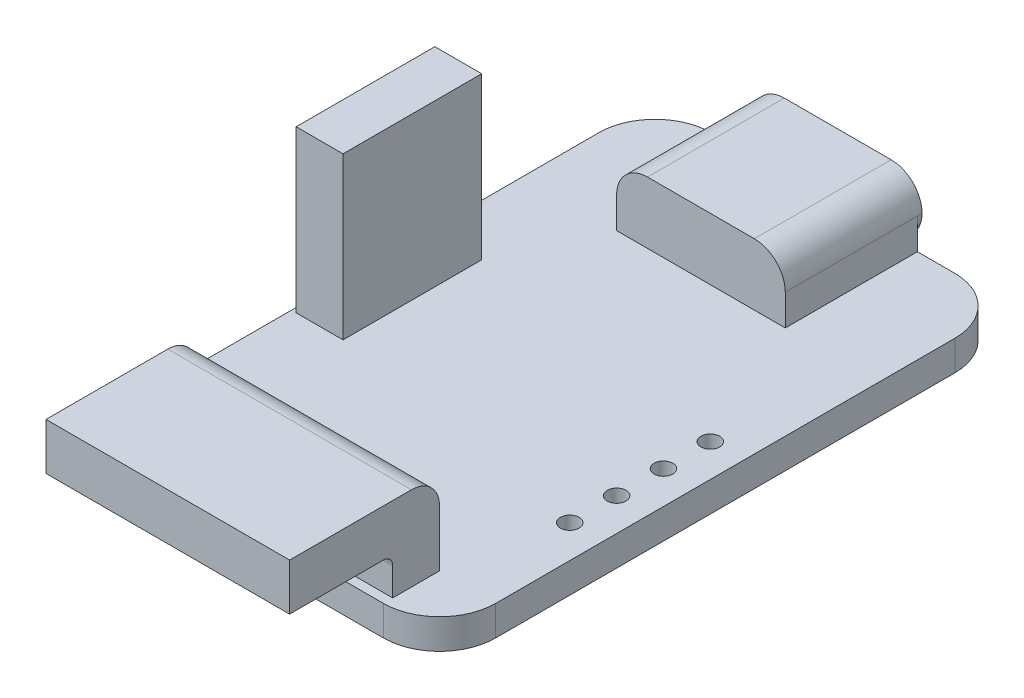
ISO-10303-21;
HEADER;
FILE_DESCRIPTION(('STEP AP214'),'2;1');
FILE_NAME('part.step','',(''),(''),'','','');
FILE_SCHEMA(('AUTOMOTIVE_DESIGN { 1 0 10303 214 1 1 1 1 }'));
ENDSEC;
DATA;
#1=APPLICATION_CONTEXT('core data for automotive mechanical design processes');
#2=APPLICATION_PROTOCOL_DEFINITION('international standard','automotive_design',2000,#1);
#3=PRODUCT_CONTEXT('',#1,'mechanical');
#4=PRODUCT('Part','Part','',(#3));
#5=PRODUCT_RELATED_PRODUCT_CATEGORY('part','',(#4));
#6=PRODUCT_DEFINITION_FORMATION('','',#4);
#7=PRODUCT_DEFINITION_CONTEXT('part definition',#1,'design');
#8=PRODUCT_DEFINITION('design','',#6,#7);
#9=PRODUCT_DEFINITION_SHAPE('','',#8);
#10=(LENGTH_UNIT() NAMED_UNIT(*) SI_UNIT(.MILLI.,.METRE.));
#11=(NAMED_UNIT(*) PLANE_ANGLE_UNIT() SI_UNIT($,.RADIAN.));
#12=(NAMED_UNIT(*) SI_UNIT($,.STERADIAN.) SOLID_ANGLE_UNIT());
#13=UNCERTAINTY_MEASURE_WITH_UNIT(LENGTH_MEASURE(1.E-05),#10,'distance_accuracy_value','');
#14=(GEOMETRIC_REPRESENTATION_CONTEXT(3) GLOBAL_UNCERTAINTY_ASSIGNED_CONTEXT((#13)) GLOBAL_UNIT_ASSIGNED_CONTEXT((#10,
#11,#12)) REPRESENTATION_CONTEXT('',''));
#15=CARTESIAN_POINT('',(0.,0.,0.));
#16=DIRECTION('',(0.,0.,1.));
#17=DIRECTION('',(1.,0.,0.));
#18=AXIS2_PLACEMENT_3D('',#15,#16,#17);
#19=CARTESIAN_POINT('',(7.75000000000001,1.6,6.55));
#20=DIRECTION('',(0.,-1.,0.));
#21=DIRECTION('',(0.,0.,-1.));
#22=AXIS2_PLACEMENT_3D('',#19,#20,#21);
#23=CYLINDRICAL_SURFACE('',#22,0.500000000000001);
#24=CARTESIAN_POINT('',(7.75000000000001,1.6,6.55));
#25=DIRECTION('',(0.,1.,0.));
#26=DIRECTION('',(0.,0.,1.));
#27=AXIS2_PLACEMENT_3D('',#24,#25,#26);
#28=CIRCLE('',#27,0.500000000000001);
#29=CARTESIAN_POINT('',(7.75000000000001,1.6,7.05));
#30=VERTEX_POINT('',#29);
#31=EDGE_CURVE('E56',#30,#30,#28,.T.);
#32=ORIENTED_EDGE('',*,*,#31,.T.);
#33=EDGE_LOOP('',(#32));
#34=FACE_BOUND('',#33,.T.);
#35=CARTESIAN_POINT('',(7.75000000000001,0.,6.55));
#36=DIRECTION('',(0.,1.,0.));
#37=DIRECTION('',(0.,0.,1.));
#38=AXIS2_PLACEMENT_3D('',#35,#36,#37);
#39=CIRCLE('',#38,0.500000000000001);
#40=CARTESIAN_POINT('',(7.75000000000001,0.,7.05));
#41=VERTEX_POINT('',#40);
#42=EDGE_CURVE('E12',#41,#41,#39,.T.);
#43=ORIENTED_EDGE('',*,*,#42,.F.);
#44=EDGE_LOOP('',(#43));
#45=FACE_BOUND('',#44,.T.);
#46=ADVANCED_FACE('F49',(#34,#45),#23,.F.);
#47=CARTESIAN_POINT('',(7.75000000000001,1.6,4.05));
#48=DIRECTION('',(0.,-1.,0.));
#49=DIRECTION('',(0.,0.,-1.));
#50=AXIS2_PLACEMENT_3D('',#47,#48,#49);
#51=CYLINDRICAL_SURFACE('',#50,0.500000000000001);
#52=CARTESIAN_POINT('',(7.75000000000001,1.6,4.05));
#53=DIRECTION('',(0.,1.,0.));
#54=DIRECTION('',(0.,0.,1.));
#55=AXIS2_PLACEMENT_3D('',#52,#53,#54);
#56=CIRCLE('',#55,0.500000000000001);
#57=CARTESIAN_POINT('',(7.75000000000001,1.6,4.55));
#58=VERTEX_POINT('',#57);
#59=EDGE_CURVE('E476',#58,#58,#56,.T.);
#60=ORIENTED_EDGE('',*,*,#59,.T.);
#61=EDGE_LOOP('',(#60));
#62=FACE_BOUND('',#61,.T.);
#63=CARTESIAN_POINT('',(7.75000000000001,0.,4.05));
#64=DIRECTION('',(0.,1.,0.));
#65=DIRECTION('',(0.,0.,1.));
#66=AXIS2_PLACEMENT_3D('',#63,#64,#65);
#67=CIRCLE('',#66,0.500000000000001);
#68=CARTESIAN_POINT('',(7.75000000000001,0.,4.55));
#69=VERTEX_POINT('',#68);
#70=EDGE_CURVE('E479',#69,#69,#67,.T.);
#71=ORIENTED_EDGE('',*,*,#70,.F.);
#72=EDGE_LOOP('',(#71));
#73=FACE_BOUND('',#72,.T.);
#74=ADVANCED_FACE('F584',(#62,#73),#51,.F.);
#75=CARTESIAN_POINT('',(7.75000000000001,1.6,1.55));
#76=DIRECTION('',(0.,-1.,0.));
#77=DIRECTION('',(0.,0.,-1.));
#78=AXIS2_PLACEMENT_3D('',#75,#76,#77);
#79=CYLINDRICAL_SURFACE('',#78,0.500000000000001);
#80=CARTESIAN_POINT('',(7.75000000000001,1.6,1.55));
#81=DIRECTION('',(0.,1.,0.));
#82=DIRECTION('',(0.,0.,1.));
#83=AXIS2_PLACEMENT_3D('',#80,#81,#82);
#84=CIRCLE('',#83,0.500000000000001);
#85=CARTESIAN_POINT('',(7.75000000000001,1.6,2.05));
#86=VERTEX_POINT('',#85);
#87=EDGE_CURVE('E470',#86,#86,#84,.T.);
#88=ORIENTED_EDGE('',*,*,#87,.T.);
#89=EDGE_LOOP('',(#88));
#90=FACE_BOUND('',#89,.T.);
#91=CARTESIAN_POINT('',(7.75000000000001,0.,1.55));
#92=DIRECTION('',(0.,1.,0.));
#93=DIRECTION('',(0.,0.,1.));
#94=AXIS2_PLACEMENT_3D('',#91,#92,#93);
#95=CIRCLE('',#94,0.500000000000001);
#96=CARTESIAN_POINT('',(7.75000000000001,0.,2.05));
#97=VERTEX_POINT('',#96);
#98=EDGE_CURVE('E473',#97,#97,#95,.T.);
#99=ORIENTED_EDGE('',*,*,#98,.F.);
#100=EDGE_LOOP('',(#99));
#101=FACE_BOUND('',#100,.T.);
#102=ADVANCED_FACE('F588',(#90,#101),#79,.F.);
#103=CARTESIAN_POINT('',(0.,6.1,14.75));
#104=DIRECTION('',(0.,0.,1.));
#105=DIRECTION('',(1.,0.,0.));
#106=AXIS2_PLACEMENT_3D('',#103,#104,#105);
#107=PLANE('',#106);
#108=DIRECTION('',(0.,-1.,0.));
#109=VECTOR('',#108,1.);
#110=CARTESIAN_POINT('',(6.5,6.1,14.75));
#111=LINE('',#110,#109);
#112=CARTESIAN_POINT('',(6.5,3.1,14.75));
#113=VERTEX_POINT('',#112);
#114=CARTESIAN_POINT('',(6.5,1.6,14.75));
#115=VERTEX_POINT('',#114);
#116=EDGE_CURVE('E289',#113,#115,#111,.T.);
#117=ORIENTED_EDGE('',*,*,#116,.F.);
#118=DIRECTION('',(1.,0.,0.));
#119=VECTOR('',#118,1.);
#120=CARTESIAN_POINT('',(0.,3.1,14.75));
#121=LINE('',#120,#119);
#122=CARTESIAN_POINT('',(-6.5,3.1,14.75));
#123=VERTEX_POINT('',#122);
#124=EDGE_CURVE('E458',#113,#123,#121,.F.);
#125=ORIENTED_EDGE('',*,*,#124,.T.);
#126=DIRECTION('',(0.,-1.,0.));
#127=VECTOR('',#126,1.);
#128=CARTESIAN_POINT('',(-6.5,6.1,14.75));
#129=LINE('',#128,#127);
#130=CARTESIAN_POINT('',(-6.5,1.6,14.75));
#131=VERTEX_POINT('',#130);
#132=EDGE_CURVE('E286',#123,#131,#129,.T.);
#133=ORIENTED_EDGE('',*,*,#132,.T.);
#134=DIRECTION('',(-1.,0.,0.));
#135=VECTOR('',#134,1.);
#136=CARTESIAN_POINT('',(0.,1.6,14.75));
#137=LINE('',#136,#135);
#138=EDGE_CURVE('E275',#115,#131,#137,.T.);
#139=ORIENTED_EDGE('',*,*,#138,.F.);
#140=EDGE_LOOP('',(#117,#125,#133,#139));
#141=FACE_BOUND('',#140,.T.);
#142=ADVANCED_FACE('F490',(#141),#107,.T.);
#143=CARTESIAN_POINT('',(0.,1.6,0.));
#144=DIRECTION('',(0.,1.,0.));
#145=DIRECTION('',(0.,0.,1.));
#146=AXIS2_PLACEMENT_3D('',#143,#144,#145);
#147=PLANE('',#146);
#148=ORIENTED_EDGE('',*,*,#31,.F.);
#149=EDGE_LOOP('',(#148));
#150=FACE_BOUND('',#149,.T.);
#151=ORIENTED_EDGE('',*,*,#59,.F.);
#152=EDGE_LOOP('',(#151));
#153=FACE_BOUND('',#152,.T.);
#154=ORIENTED_EDGE('',*,*,#87,.F.);
#155=EDGE_LOOP('',(#154));
#156=FACE_BOUND('',#155,.T.);
#157=DIRECTION('',(0.,0.,-1.));
#158=VECTOR('',#157,1.);
#159=CARTESIAN_POINT('',(-6.5,1.6,0.));
#160=LINE('',#159,#158);
#161=CARTESIAN_POINT('',(-6.5,1.6,12.25));
#162=VERTEX_POINT('',#161);
#163=EDGE_CURVE('E264',#131,#162,#160,.T.);
#164=ORIENTED_EDGE('',*,*,#163,.T.);
#165=DIRECTION('',(-1.,0.,0.));
#166=VECTOR('',#165,1.);
#167=CARTESIAN_POINT('',(0.,1.6,12.25));
#168=LINE('',#167,#166);
#169=CARTESIAN_POINT('',(6.5,1.6,12.25));
#170=VERTEX_POINT('',#169);
#171=EDGE_CURVE('E267',#170,#162,#168,.T.);
#172=ORIENTED_EDGE('',*,*,#171,.F.);
#173=DIRECTION('',(0.,0.,-1.));
#174=VECTOR('',#173,1.);
#175=CARTESIAN_POINT('',(6.5,1.6,0.));
#176=LINE('',#175,#174);
#177=EDGE_CURVE('E281',#115,#170,#176,.T.);
#178=ORIENTED_EDGE('',*,*,#177,.F.);
#179=ORIENTED_EDGE('',*,*,#138,.T.);
#180=EDGE_LOOP('',(#164,#172,#178,#179));
#181=FACE_BOUND('',#180,.T.);
#182=DIRECTION('',(-1.,0.,0.));
#183=VECTOR('',#182,1.);
#184=CARTESIAN_POINT('',(0.,1.6,4.15));
#185=LINE('',#184,#183);
#186=CARTESIAN_POINT('',(-6.75,1.6,4.15));
#187=VERTEX_POINT('',#186);
#188=CARTESIAN_POINT('',(-9.25,1.6,4.15));
#189=VERTEX_POINT('',#188);
#190=EDGE_CURVE('E288',#187,#189,#185,.T.);
#191=ORIENTED_EDGE('',*,*,#190,.T.);
#192=DIRECTION('',(0.,0.,-1.));
#193=VECTOR('',#192,1.);
#194=CARTESIAN_POINT('',(-9.25,1.6,0.));
#195=LINE('',#194,#193);
#196=CARTESIAN_POINT('',(-9.25,1.6,-3.25));
#197=VERTEX_POINT('',#196);
#198=EDGE_CURVE('E307',#189,#197,#195,.T.);
#199=ORIENTED_EDGE('',*,*,#198,.T.);
#200=DIRECTION('',(-1.,0.,0.));
#201=VECTOR('',#200,1.);
#202=CARTESIAN_POINT('',(0.,1.6,-3.25));
#203=LINE('',#202,#201);
#204=CARTESIAN_POINT('',(-6.75,1.6,-3.25));
#205=VERTEX_POINT('',#204);
#206=EDGE_CURVE('E309',#205,#197,#203,.T.);
#207=ORIENTED_EDGE('',*,*,#206,.F.);
#208=DIRECTION('',(0.,0.,-1.));
#209=VECTOR('',#208,1.);
#210=CARTESIAN_POINT('',(-6.75,1.6,0.));
#211=LINE('',#210,#209);
#212=EDGE_CURVE('E298',#187,#205,#211,.T.);
#213=ORIENTED_EDGE('',*,*,#212,.F.);
#214=EDGE_LOOP('',(#191,#199,#207,#213));
#215=FACE_BOUND('',#214,.T.);
#216=CARTESIAN_POINT('',(7.75000000000001,1.6,-0.95));
#217=DIRECTION('',(0.,1.,0.));
#218=DIRECTION('',(0.,0.,1.));
#219=AXIS2_PLACEMENT_3D('',#216,#217,#218);
#220=CIRCLE('',#219,0.500000000000001);
#221=CARTESIAN_POINT('',(7.75000000000001,1.6,-0.449999999999999));
#222=VERTEX_POINT('',#221);
#223=EDGE_CURVE('E364',#222,#222,#220,.T.);
#224=ORIENTED_EDGE('',*,*,#223,.F.);
#225=EDGE_LOOP('',(#224));
#226=FACE_BOUND('',#225,.T.);
#227=DIRECTION('',(-1.,0.,0.));
#228=VECTOR('',#227,1.);
#229=CARTESIAN_POINT('',(0.,1.6,-8.2));
#230=LINE('',#229,#228);
#231=CARTESIAN_POINT('',(4.5,1.6,-8.20000000000001));
#232=VERTEX_POINT('',#231);
#233=CARTESIAN_POINT('',(-4.5,1.6,-8.2));
#234=VERTEX_POINT('',#233);
#235=EDGE_CURVE('E330',#232,#234,#230,.T.);
#236=ORIENTED_EDGE('',*,*,#235,.T.);
#237=DIRECTION('',(0.,0.,-1.));
#238=VECTOR('',#237,1.);
#239=CARTESIAN_POINT('',(-4.5,1.6,0.));
#240=LINE('',#239,#238);
#241=CARTESIAN_POINT('',(-4.5,1.6,-15.25));
#242=VERTEX_POINT('',#241);
#243=EDGE_CURVE('E334',#234,#242,#240,.T.);
#244=ORIENTED_EDGE('',*,*,#243,.T.);
#245=DIRECTION('',(1.,0.,0.));
#246=VECTOR('',#245,1.);
#247=CARTESIAN_POINT('',(0.,1.6,-15.25));
#248=LINE('',#247,#246);
#249=CARTESIAN_POINT('',(-6.5,1.6,-15.25));
#250=VERTEX_POINT('',#249);
#251=EDGE_CURVE('E350',#250,#242,#248,.T.);
#252=ORIENTED_EDGE('',*,*,#251,.F.);
#253=CARTESIAN_POINT('',(-6.5,1.6,-12.25));
#254=DIRECTION('',(0.,1.,0.));
#255=DIRECTION('',(0.,0.,1.));
#256=AXIS2_PLACEMENT_3D('',#253,#254,#255);
#257=CIRCLE('',#256,3.);
#258=CARTESIAN_POINT('',(-9.5,1.6,-12.25));
#259=VERTEX_POINT('',#258);
#260=EDGE_CURVE('E399',#250,#259,#257,.T.);
#261=ORIENTED_EDGE('',*,*,#260,.T.);
#262=DIRECTION('',(0.,0.,-1.));
#263=VECTOR('',#262,1.);
#264=CARTESIAN_POINT('',(-9.5,1.6,0.));
#265=LINE('',#264,#263);
#266=CARTESIAN_POINT('',(-9.5,1.6,12.25));
#267=VERTEX_POINT('',#266);
#268=EDGE_CURVE('E353',#267,#259,#265,.T.);
#269=ORIENTED_EDGE('',*,*,#268,.F.);
#270=CARTESIAN_POINT('',(-6.5,1.6,12.25));
#271=DIRECTION('',(0.,1.,0.));
#272=DIRECTION('',(0.,0.,1.));
#273=AXIS2_PLACEMENT_3D('',#270,#271,#272);
#274=CIRCLE('',#273,3.);
#275=CARTESIAN_POINT('',(-6.5,1.6,15.25));
#276=VERTEX_POINT('',#275);
#277=EDGE_CURVE('E406',#267,#276,#274,.T.);
#278=ORIENTED_EDGE('',*,*,#277,.T.);
#279=DIRECTION('',(1.,0.,0.));
#280=VECTOR('',#279,1.);
#281=CARTESIAN_POINT('',(0.,1.6,15.25));
#282=LINE('',#281,#280);
#283=CARTESIAN_POINT('',(6.5,1.6,15.25));
#284=VERTEX_POINT('',#283);
#285=EDGE_CURVE('E358',#276,#284,#282,.T.);
#286=ORIENTED_EDGE('',*,*,#285,.T.);
#287=CARTESIAN_POINT('',(6.5,1.6,12.25));
#288=DIRECTION('',(0.,1.,0.));
#289=DIRECTION('',(0.,0.,1.));
#290=AXIS2_PLACEMENT_3D('',#287,#288,#289);
#291=CIRCLE('',#290,3.);
#292=CARTESIAN_POINT('',(9.5,1.6,12.25));
#293=VERTEX_POINT('',#292);
#294=EDGE_CURVE('E404',#284,#293,#291,.T.);
#295=ORIENTED_EDGE('',*,*,#294,.T.);
#296=DIRECTION('',(0.,0.,-1.));
#297=VECTOR('',#296,1.);
#298=CARTESIAN_POINT('',(9.5,1.6,0.));
#299=LINE('',#298,#297);
#300=CARTESIAN_POINT('',(9.5,1.6,-12.25));
#301=VERTEX_POINT('',#300);
#302=EDGE_CURVE('E361',#293,#301,#299,.T.);
#303=ORIENTED_EDGE('',*,*,#302,.T.);
#304=CARTESIAN_POINT('',(6.5,1.6,-12.25));
#305=DIRECTION('',(0.,1.,0.));
#306=DIRECTION('',(0.,0.,1.));
#307=AXIS2_PLACEMENT_3D('',#304,#305,#306);
#308=CIRCLE('',#307,3.);
#309=CARTESIAN_POINT('',(6.5,1.6,-15.25));
#310=VERTEX_POINT('',#309);
#311=EDGE_CURVE('E401',#301,#310,#308,.T.);
#312=ORIENTED_EDGE('',*,*,#311,.T.);
#313=CARTESIAN_POINT('',(4.5,1.6,-15.25));
#314=VERTEX_POINT('',#313);
#315=EDGE_CURVE('E355',#314,#310,#248,.T.);
#316=ORIENTED_EDGE('',*,*,#315,.F.);
#317=DIRECTION('',(0.,0.,-1.));
#318=VECTOR('',#317,1.);
#319=CARTESIAN_POINT('',(4.5,1.6,0.));
#320=LINE('',#319,#318);
#321=EDGE_CURVE('E341',#232,#314,#320,.T.);
#322=ORIENTED_EDGE('',*,*,#321,.F.);
#323=EDGE_LOOP('',(#236,#244,#252,#261,#269,#278,#286,#295,#303,#312,#316,#322));
#324=FACE_BOUND('',#323,.T.);
#325=ADVANCED_FACE('F486',(#150,#153,#156,#181,#215,#226,#324),#147,.T.);
#326=CARTESIAN_POINT('',(0.,1.6,-15.25));
#327=DIRECTION('',(0.,0.,-1.));
#328=DIRECTION('',(-1.,0.,0.));
#329=AXIS2_PLACEMENT_3D('',#326,#327,#328);
#330=PLANE('',#329);
#331=ORIENTED_EDGE('',*,*,#251,.T.);
#332=DIRECTION('',(0.,-1.,0.));
#333=VECTOR('',#332,1.);
#334=CARTESIAN_POINT('',(-4.5,4.9,-15.25));
#335=LINE('',#334,#333);
#336=CARTESIAN_POINT('',(-4.5,3.25,-15.25));
#337=VERTEX_POINT('',#336);
#338=EDGE_CURVE('E418',#337,#242,#335,.T.);
#339=ORIENTED_EDGE('',*,*,#338,.F.);
#340=CARTESIAN_POINT('',(-2.85,3.25,-15.25));
#341=DIRECTION('',(0.,0.,-1.));
#342=DIRECTION('',(-1.,0.,0.));
#343=AXIS2_PLACEMENT_3D('',#340,#341,#342);
#344=CIRCLE('',#343,1.65);
#345=CARTESIAN_POINT('',(-2.85,1.6,-15.25));
#346=VERTEX_POINT('',#345);
#347=EDGE_CURVE('E449',#337,#346,#344,.F.);
#348=ORIENTED_EDGE('',*,*,#347,.T.);
#349=CARTESIAN_POINT('',(2.85,1.6,-15.25));
#350=VERTEX_POINT('',#349);
#351=EDGE_CURVE('E354',#346,#350,#248,.T.);
#352=ORIENTED_EDGE('',*,*,#351,.T.);
#353=CARTESIAN_POINT('',(2.85,3.25,-15.25));
#354=DIRECTION('',(0.,0.,-1.));
#355=DIRECTION('',(-1.,0.,0.));
#356=AXIS2_PLACEMENT_3D('',#353,#354,#355);
#357=CIRCLE('',#356,1.65);
#358=CARTESIAN_POINT('',(4.5,3.25,-15.25));
#359=VERTEX_POINT('',#358);
#360=EDGE_CURVE('E451',#350,#359,#357,.F.);
#361=ORIENTED_EDGE('',*,*,#360,.T.);
#362=DIRECTION('',(0.,1.,0.));
#363=VECTOR('',#362,1.);
#364=CARTESIAN_POINT('',(4.5,1.6,-15.25));
#365=LINE('',#364,#363);
#366=EDGE_CURVE('E444',#314,#359,#365,.T.);
#367=ORIENTED_EDGE('',*,*,#366,.F.);
#368=ORIENTED_EDGE('',*,*,#315,.T.);
#369=DIRECTION('',(0.,-1.,0.));
#370=VECTOR('',#369,1.);
#371=CARTESIAN_POINT('',(6.5,0.,-15.25));
#372=LINE('',#371,#370);
#373=CARTESIAN_POINT('',(6.5,0.,-15.25));
#374=VERTEX_POINT('',#373);
#375=EDGE_CURVE('E415',#310,#374,#372,.T.);
#376=ORIENTED_EDGE('',*,*,#375,.T.);
#377=DIRECTION('',(1.,0.,0.));
#378=VECTOR('',#377,1.);
#379=CARTESIAN_POINT('',(0.,0.,-15.25));
#380=LINE('',#379,#378);
#381=CARTESIAN_POINT('',(-6.5,0.,-15.25));
#382=VERTEX_POINT('',#381);
#383=EDGE_CURVE('E348',#382,#374,#380,.T.);
#384=ORIENTED_EDGE('',*,*,#383,.F.);
#385=DIRECTION('',(0.,-1.,0.));
#386=VECTOR('',#385,1.);
#387=CARTESIAN_POINT('',(-6.5,1.6,-15.25));
#388=LINE('',#387,#386);
#389=EDGE_CURVE('E413',#382,#250,#388,.F.);
#390=ORIENTED_EDGE('',*,*,#389,.T.);
#391=EDGE_LOOP('',(#331,#339,#348,#352,#361,#367,#368,#376,#384,#390));
#392=FACE_BOUND('',#391,.T.);
#393=ADVANCED_FACE('F489',(#392),#330,.T.);
#394=CARTESIAN_POINT('',(-9.5,1.6,0.));
#395=DIRECTION('',(-1.,0.,0.));
#396=DIRECTION('',(0.,0.,1.));
#397=AXIS2_PLACEMENT_3D('',#394,#395,#396);
#398=PLANE('',#397);
#399=DIRECTION('',(0.,0.,-1.));
#400=VECTOR('',#399,1.);
#401=CARTESIAN_POINT('',(-9.5,0.,0.));
#402=LINE('',#401,#400);
#403=CARTESIAN_POINT('',(-9.5,0.,12.25));
#404=VERTEX_POINT('',#403);
#405=CARTESIAN_POINT('',(-9.5,0.,-12.25));
#406=VERTEX_POINT('',#405);
#407=EDGE_CURVE('E370',#404,#406,#402,.T.);
#408=ORIENTED_EDGE('',*,*,#407,.F.);
#409=DIRECTION('',(0.,-1.,0.));
#410=VECTOR('',#409,1.);
#411=CARTESIAN_POINT('',(-9.5,1.6,12.25));
#412=LINE('',#411,#410);
#413=EDGE_CURVE('E397',#404,#267,#412,.F.);
#414=ORIENTED_EDGE('',*,*,#413,.T.);
#415=ORIENTED_EDGE('',*,*,#268,.T.);
#416=DIRECTION('',(0.,-1.,0.));
#417=VECTOR('',#416,1.);
#418=CARTESIAN_POINT('',(-9.5,1.6,-12.25));
#419=LINE('',#418,#417);
#420=EDGE_CURVE('E394',#259,#406,#419,.T.);
#421=ORIENTED_EDGE('',*,*,#420,.T.);
#422=EDGE_LOOP('',(#408,#414,#415,#421));
#423=FACE_BOUND('',#422,.T.);
#424=ADVANCED_FACE('F531',(#423),#398,.T.);
#425=CARTESIAN_POINT('',(0.,1.6,15.25));
#426=DIRECTION('',(0.,0.,-1.));
#427=DIRECTION('',(-1.,0.,0.));
#428=AXIS2_PLACEMENT_3D('',#425,#426,#427);
#429=PLANE('',#428);
#430=ORIENTED_EDGE('',*,*,#285,.F.);
#431=DIRECTION('',(0.,-1.,0.));
#432=VECTOR('',#431,1.);
#433=CARTESIAN_POINT('',(-6.5,0.,15.25));
#434=LINE('',#433,#432);
#435=CARTESIAN_POINT('',(-6.5,0.,15.25));
#436=VERTEX_POINT('',#435);
#437=EDGE_CURVE('E383',#276,#436,#434,.T.);
#438=ORIENTED_EDGE('',*,*,#437,.T.);
#439=DIRECTION('',(1.,0.,0.));
#440=VECTOR('',#439,1.);
#441=CARTESIAN_POINT('',(0.,0.,15.25));
#442=LINE('',#441,#440);
#443=CARTESIAN_POINT('',(6.5,0.,15.25));
#444=VERTEX_POINT('',#443);
#445=EDGE_CURVE('E373',#436,#444,#442,.T.);
#446=ORIENTED_EDGE('',*,*,#445,.T.);
#447=DIRECTION('',(0.,-1.,0.));
#448=VECTOR('',#447,1.);
#449=CARTESIAN_POINT('',(6.5,1.6,15.25));
#450=LINE('',#449,#448);
#451=EDGE_CURVE('E367',#444,#284,#450,.F.);
#452=ORIENTED_EDGE('',*,*,#451,.T.);
#453=EDGE_LOOP('',(#430,#438,#446,#452));
#454=FACE_BOUND('',#453,.T.);
#455=ADVANCED_FACE('F543',(#454),#429,.F.);
#456=CARTESIAN_POINT('',(9.5,1.6,0.));
#457=DIRECTION('',(-1.,0.,0.));
#458=DIRECTION('',(0.,0.,1.));
#459=AXIS2_PLACEMENT_3D('',#456,#457,#458);
#460=PLANE('',#459);
#461=ORIENTED_EDGE('',*,*,#302,.F.);
#462=DIRECTION('',(0.,-1.,0.));
#463=VECTOR('',#462,1.);
#464=CARTESIAN_POINT('',(9.5,1.6,12.25));
#465=LINE('',#464,#463);
#466=CARTESIAN_POINT('',(9.5,0.,12.25));
#467=VERTEX_POINT('',#466);
#468=EDGE_CURVE('E410',#293,#467,#465,.T.);
#469=ORIENTED_EDGE('',*,*,#468,.T.);
#470=DIRECTION('',(0.,0.,-1.));
#471=VECTOR('',#470,1.);
#472=CARTESIAN_POINT('',(9.5,0.,0.));
#473=LINE('',#472,#471);
#474=CARTESIAN_POINT('',(9.5,0.,-12.25));
#475=VERTEX_POINT('',#474);
#476=EDGE_CURVE('E376',#467,#475,#473,.T.);
#477=ORIENTED_EDGE('',*,*,#476,.T.);
#478=DIRECTION('',(0.,-1.,0.));
#479=VECTOR('',#478,1.);
#480=CARTESIAN_POINT('',(9.5,1.6,-12.25));
#481=LINE('',#480,#479);
#482=EDGE_CURVE('E408',#475,#301,#481,.F.);
#483=ORIENTED_EDGE('',*,*,#482,.T.);
#484=EDGE_LOOP('',(#461,#469,#477,#483));
#485=FACE_BOUND('',#484,.T.);
#486=ADVANCED_FACE('F552',(#485),#460,.F.);
#487=CARTESIAN_POINT('',(7.75000000000001,1.6,-0.95));
#488=DIRECTION('',(0.,-1.,0.));
#489=DIRECTION('',(0.,0.,-1.));
#490=AXIS2_PLACEMENT_3D('',#487,#488,#489);
#491=CYLINDRICAL_SURFACE('',#490,0.500000000000001);
#492=ORIENTED_EDGE('',*,*,#223,.T.);
#493=EDGE_LOOP('',(#492));
#494=FACE_BOUND('',#493,.T.);
#495=CARTESIAN_POINT('',(7.75000000000001,0.,-0.95));
#496=DIRECTION('',(0.,1.,0.));
#497=DIRECTION('',(0.,0.,1.));
#498=AXIS2_PLACEMENT_3D('',#495,#496,#497);
#499=CIRCLE('',#498,0.500000000000001);
#500=CARTESIAN_POINT('',(7.75000000000001,0.,-0.449999999999999));
#501=VERTEX_POINT('',#500);
#502=EDGE_CURVE('E379',#501,#501,#499,.T.);
#503=ORIENTED_EDGE('',*,*,#502,.F.);
#504=EDGE_LOOP('',(#503));
#505=FACE_BOUND('',#504,.T.);
#506=ADVANCED_FACE('F635',(#494,#505),#491,.F.);
#507=CARTESIAN_POINT('',(0.,0.,0.));
#508=DIRECTION('',(0.,1.,0.));
#509=DIRECTION('',(0.,0.,1.));
#510=AXIS2_PLACEMENT_3D('',#507,#508,#509);
#511=PLANE('',#510);
#512=ORIENTED_EDGE('',*,*,#42,.T.);
#513=EDGE_LOOP('',(#512));
#514=FACE_BOUND('',#513,.T.);
#515=ORIENTED_EDGE('',*,*,#70,.T.);
#516=EDGE_LOOP('',(#515));
#517=FACE_BOUND('',#516,.T.);
#518=ORIENTED_EDGE('',*,*,#98,.T.);
#519=EDGE_LOOP('',(#518));
#520=FACE_BOUND('',#519,.T.);
#521=ORIENTED_EDGE('',*,*,#445,.F.);
#522=CARTESIAN_POINT('',(-6.5,0.,12.25));
#523=DIRECTION('',(0.,1.,0.));
#524=DIRECTION('',(0.,0.,1.));
#525=AXIS2_PLACEMENT_3D('',#522,#523,#524);
#526=CIRCLE('',#525,3.);
#527=EDGE_CURVE('E392',#436,#404,#526,.F.);
#528=ORIENTED_EDGE('',*,*,#527,.T.);
#529=ORIENTED_EDGE('',*,*,#407,.T.);
#530=CARTESIAN_POINT('',(-6.5,0.,-12.25));
#531=DIRECTION('',(0.,1.,0.));
#532=DIRECTION('',(0.,0.,1.));
#533=AXIS2_PLACEMENT_3D('',#530,#531,#532);
#534=CIRCLE('',#533,3.);
#535=EDGE_CURVE('E386',#406,#382,#534,.F.);
#536=ORIENTED_EDGE('',*,*,#535,.T.);
#537=ORIENTED_EDGE('',*,*,#383,.T.);
#538=CARTESIAN_POINT('',(6.5,0.,-12.25));
#539=DIRECTION('',(0.,1.,0.));
#540=DIRECTION('',(0.,0.,1.));
#541=AXIS2_PLACEMENT_3D('',#538,#539,#540);
#542=CIRCLE('',#541,3.);
#543=EDGE_CURVE('E388',#374,#475,#542,.F.);
#544=ORIENTED_EDGE('',*,*,#543,.T.);
#545=ORIENTED_EDGE('',*,*,#476,.F.);
#546=CARTESIAN_POINT('',(6.5,0.,12.25));
#547=DIRECTION('',(0.,1.,0.));
#548=DIRECTION('',(0.,0.,1.));
#549=AXIS2_PLACEMENT_3D('',#546,#547,#548);
#550=CIRCLE('',#549,3.);
#551=EDGE_CURVE('E390',#467,#444,#550,.F.);
#552=ORIENTED_EDGE('',*,*,#551,.T.);
#553=EDGE_LOOP('',(#521,#528,#529,#536,#537,#544,#545,#552));
#554=FACE_BOUND('',#553,.T.);
#555=ORIENTED_EDGE('',*,*,#502,.T.);
#556=EDGE_LOOP('',(#555));
#557=FACE_BOUND('',#556,.T.);
#558=ADVANCED_FACE('F535',(#514,#517,#520,#554,#557),#511,.F.);
#559=CARTESIAN_POINT('',(-6.5,1.6,12.25));
#560=DIRECTION('',(0.,1.,0.));
#561=DIRECTION('',(0.,0.,1.));
#562=AXIS2_PLACEMENT_3D('',#559,#560,#561);
#563=CYLINDRICAL_SURFACE('',#562,3.);
#564=ORIENTED_EDGE('',*,*,#277,.F.);
#565=ORIENTED_EDGE('',*,*,#413,.F.);
#566=ORIENTED_EDGE('',*,*,#527,.F.);
#567=ORIENTED_EDGE('',*,*,#437,.F.);
#568=EDGE_LOOP('',(#564,#565,#566,#567));
#569=FACE_BOUND('',#568,.T.);
#570=ADVANCED_FACE('F540',(#569),#563,.T.);
#571=CARTESIAN_POINT('',(6.5,1.6,12.25));
#572=DIRECTION('',(0.,-1.,0.));
#573=DIRECTION('',(0.,0.,-1.));
#574=AXIS2_PLACEMENT_3D('',#571,#572,#573);
#575=CYLINDRICAL_SURFACE('',#574,3.);
#576=ORIENTED_EDGE('',*,*,#294,.F.);
#577=ORIENTED_EDGE('',*,*,#451,.F.);
#578=ORIENTED_EDGE('',*,*,#551,.F.);
#579=ORIENTED_EDGE('',*,*,#468,.F.);
#580=EDGE_LOOP('',(#576,#577,#578,#579));
#581=FACE_BOUND('',#580,.T.);
#582=ADVANCED_FACE('F549',(#581),#575,.T.);
#583=CARTESIAN_POINT('',(6.5,1.6,-12.25));
#584=DIRECTION('',(0.,1.,0.));
#585=DIRECTION('',(0.,0.,1.));
#586=AXIS2_PLACEMENT_3D('',#583,#584,#585);
#587=CYLINDRICAL_SURFACE('',#586,3.);
#588=ORIENTED_EDGE('',*,*,#311,.F.);
#589=ORIENTED_EDGE('',*,*,#482,.F.);
#590=ORIENTED_EDGE('',*,*,#543,.F.);
#591=ORIENTED_EDGE('',*,*,#375,.F.);
#592=EDGE_LOOP('',(#588,#589,#590,#591));
#593=FACE_BOUND('',#592,.T.);
#594=ADVANCED_FACE('F557',(#593),#587,.T.);
#595=CARTESIAN_POINT('',(-6.5,1.6,-12.25));
#596=DIRECTION('',(0.,-1.,0.));
#597=DIRECTION('',(0.,0.,-1.));
#598=AXIS2_PLACEMENT_3D('',#595,#596,#597);
#599=CYLINDRICAL_SURFACE('',#598,3.);
#600=ORIENTED_EDGE('',*,*,#260,.F.);
#601=ORIENTED_EDGE('',*,*,#389,.F.);
#602=ORIENTED_EDGE('',*,*,#535,.F.);
#603=ORIENTED_EDGE('',*,*,#420,.F.);
#604=EDGE_LOOP('',(#600,#601,#602,#603));
#605=FACE_BOUND('',#604,.T.);
#606=ADVANCED_FACE('F528',(#605),#599,.T.);
#607=CARTESIAN_POINT('',(-4.5,4.9,0.));
#608=DIRECTION('',(-1.,0.,0.));
#609=DIRECTION('',(0.,0.,1.));
#610=AXIS2_PLACEMENT_3D('',#607,#608,#609);
#611=PLANE('',#610);
#612=DIRECTION('',(0.,-1.,0.));
#613=VECTOR('',#612,1.);
#614=CARTESIAN_POINT('',(-4.5,4.9,-8.2));
#615=LINE('',#614,#613);
#616=CARTESIAN_POINT('',(-4.5,3.25,-8.2));
#617=VERTEX_POINT('',#616);
#618=EDGE_CURVE('E346',#617,#234,#615,.T.);
#619=ORIENTED_EDGE('',*,*,#618,.F.);
#620=DIRECTION('',(0.,0.,-1.));
#621=VECTOR('',#620,1.);
#622=CARTESIAN_POINT('',(-4.5,3.25,0.));
#623=LINE('',#622,#621);
#624=EDGE_CURVE('E420',#617,#337,#623,.T.);
#625=ORIENTED_EDGE('',*,*,#624,.T.);
#626=ORIENTED_EDGE('',*,*,#338,.T.);
#627=ORIENTED_EDGE('',*,*,#243,.F.);
#628=EDGE_LOOP('',(#619,#625,#626,#627));
#629=FACE_BOUND('',#628,.T.);
#630=ADVANCED_FACE('F516',(#629),#611,.T.);
#631=CARTESIAN_POINT('',(0.,4.9,-8.2));
#632=DIRECTION('',(0.,0.,1.));
#633=DIRECTION('',(1.,0.,0.));
#634=AXIS2_PLACEMENT_3D('',#631,#632,#633);
#635=PLANE('',#634);
#636=DIRECTION('',(-1.,0.,0.));
#637=VECTOR('',#636,1.);
#638=CARTESIAN_POINT('',(0.,4.9,-8.2));
#639=LINE('',#638,#637);
#640=CARTESIAN_POINT('',(2.85,4.9,-8.2));
#641=VERTEX_POINT('',#640);
#642=CARTESIAN_POINT('',(-2.85,4.9,-8.2));
#643=VERTEX_POINT('',#642);
#644=EDGE_CURVE('E329',#641,#643,#639,.T.);
#645=ORIENTED_EDGE('',*,*,#644,.T.);
#646=CARTESIAN_POINT('',(-2.85,3.25,-8.2));
#647=DIRECTION('',(0.,0.,1.));
#648=DIRECTION('',(1.,0.,0.));
#649=AXIS2_PLACEMENT_3D('',#646,#647,#648);
#650=CIRCLE('',#649,1.65);
#651=EDGE_CURVE('E438',#643,#617,#650,.T.);
#652=ORIENTED_EDGE('',*,*,#651,.T.);
#653=ORIENTED_EDGE('',*,*,#618,.T.);
#654=ORIENTED_EDGE('',*,*,#235,.F.);
#655=DIRECTION('',(0.,-1.,0.));
#656=VECTOR('',#655,1.);
#657=CARTESIAN_POINT('',(4.5,4.9,-8.20000000000001));
#658=LINE('',#657,#656);
#659=CARTESIAN_POINT('',(4.5,3.25,-8.20000000000001));
#660=VERTEX_POINT('',#659);
#661=EDGE_CURVE('E333',#660,#232,#658,.T.);
#662=ORIENTED_EDGE('',*,*,#661,.F.);
#663=CARTESIAN_POINT('',(2.85,3.25,-8.2));
#664=DIRECTION('',(0.,0.,1.));
#665=DIRECTION('',(1.,0.,0.));
#666=AXIS2_PLACEMENT_3D('',#663,#664,#665);
#667=CIRCLE('',#666,1.65);
#668=EDGE_CURVE('E436',#660,#641,#667,.T.);
#669=ORIENTED_EDGE('',*,*,#668,.T.);
#670=EDGE_LOOP('',(#645,#652,#653,#654,#662,#669));
#671=FACE_BOUND('',#670,.T.);
#672=ADVANCED_FACE('F510',(#671),#635,.T.);
#673=CARTESIAN_POINT('',(4.5,4.9,0.));
#674=DIRECTION('',(-1.,0.,0.));
#675=DIRECTION('',(0.,0.,1.));
#676=AXIS2_PLACEMENT_3D('',#673,#674,#675);
#677=PLANE('',#676);
#678=ORIENTED_EDGE('',*,*,#366,.T.);
#679=DIRECTION('',(0.,0.,-1.));
#680=VECTOR('',#679,1.);
#681=CARTESIAN_POINT('',(4.5,3.25,-8.20000000000001));
#682=LINE('',#681,#680);
#683=EDGE_CURVE('E447',#359,#660,#682,.F.);
#684=ORIENTED_EDGE('',*,*,#683,.T.);
#685=ORIENTED_EDGE('',*,*,#661,.T.);
#686=ORIENTED_EDGE('',*,*,#321,.T.);
#687=EDGE_LOOP('',(#678,#684,#685,#686));
#688=FACE_BOUND('',#687,.T.);
#689=ADVANCED_FACE('F571',(#688),#677,.F.);
#690=CARTESIAN_POINT('',(0.,4.9,-15.5));
#691=DIRECTION('',(0.,0.,1.));
#692=DIRECTION('',(1.,0.,0.));
#693=AXIS2_PLACEMENT_3D('',#690,#691,#692);
#694=PLANE('',#693);
#695=CARTESIAN_POINT('',(-2.85,3.25,-15.5));
#696=DIRECTION('',(0.,0.,1.));
#697=DIRECTION('',(1.,0.,0.));
#698=AXIS2_PLACEMENT_3D('',#695,#696,#697);
#699=CIRCLE('',#698,1.65);
#700=CARTESIAN_POINT('',(-2.85,1.6,-15.5));
#701=VERTEX_POINT('',#700);
#702=CARTESIAN_POINT('',(-4.5,3.25,-15.5));
#703=VERTEX_POINT('',#702);
#704=EDGE_CURVE('E427',#701,#703,#699,.F.);
#705=ORIENTED_EDGE('',*,*,#704,.T.);
#706=CARTESIAN_POINT('',(-2.85,3.25,-15.5));
#707=DIRECTION('',(0.,0.,1.));
#708=DIRECTION('',(1.,0.,0.));
#709=AXIS2_PLACEMENT_3D('',#706,#707,#708);
#710=CIRCLE('',#709,1.65);
#711=CARTESIAN_POINT('',(-2.85,4.9,-15.5));
#712=VERTEX_POINT('',#711);
#713=EDGE_CURVE('E429',#703,#712,#710,.F.);
#714=ORIENTED_EDGE('',*,*,#713,.T.);
#715=DIRECTION('',(-1.,0.,0.));
#716=VECTOR('',#715,1.);
#717=CARTESIAN_POINT('',(0.,4.9,-15.5));
#718=LINE('',#717,#716);
#719=CARTESIAN_POINT('',(2.85,4.9,-15.5));
#720=VERTEX_POINT('',#719);
#721=EDGE_CURVE('E326',#720,#712,#718,.T.);
#722=ORIENTED_EDGE('',*,*,#721,.F.);
#723=CARTESIAN_POINT('',(2.85,3.25,-15.5));
#724=DIRECTION('',(0.,0.,1.));
#725=DIRECTION('',(1.,0.,0.));
#726=AXIS2_PLACEMENT_3D('',#723,#724,#725);
#727=CIRCLE('',#726,1.65);
#728=CARTESIAN_POINT('',(4.5,3.25,-15.5));
#729=VERTEX_POINT('',#728);
#730=EDGE_CURVE('E425',#720,#729,#727,.F.);
#731=ORIENTED_EDGE('',*,*,#730,.T.);
#732=CARTESIAN_POINT('',(2.85,3.25,-15.5));
#733=DIRECTION('',(0.,0.,1.));
#734=DIRECTION('',(1.,0.,0.));
#735=AXIS2_PLACEMENT_3D('',#732,#733,#734);
#736=CIRCLE('',#735,1.65);
#737=CARTESIAN_POINT('',(2.85,1.6,-15.5));
#738=VERTEX_POINT('',#737);
#739=EDGE_CURVE('E423',#729,#738,#736,.F.);
#740=ORIENTED_EDGE('',*,*,#739,.T.);
#741=DIRECTION('',(-1.,0.,0.));
#742=VECTOR('',#741,1.);
#743=CARTESIAN_POINT('',(0.,1.6,-15.5));
#744=LINE('',#743,#742);
#745=EDGE_CURVE('E337',#738,#701,#744,.T.);
#746=ORIENTED_EDGE('',*,*,#745,.T.);
#747=EDGE_LOOP('',(#705,#714,#722,#731,#740,#746));
#748=FACE_BOUND('',#747,.T.);
#749=ADVANCED_FACE('F573',(#748),#694,.F.);
#750=CARTESIAN_POINT('',(0.,4.9,0.));
#751=DIRECTION('',(0.,1.,0.));
#752=DIRECTION('',(0.,0.,1.));
#753=AXIS2_PLACEMENT_3D('',#750,#751,#752);
#754=PLANE('',#753);
#755=ORIENTED_EDGE('',*,*,#721,.T.);
#756=DIRECTION('',(0.,0.,-1.));
#757=VECTOR('',#756,1.);
#758=CARTESIAN_POINT('',(-2.85,4.9,0.));
#759=LINE('',#758,#757);
#760=EDGE_CURVE('E434',#712,#643,#759,.F.);
#761=ORIENTED_EDGE('',*,*,#760,.T.);
#762=ORIENTED_EDGE('',*,*,#644,.F.);
#763=DIRECTION('',(0.,0.,-1.));
#764=VECTOR('',#763,1.);
#765=CARTESIAN_POINT('',(2.85,4.9,-15.5));
#766=LINE('',#765,#764);
#767=EDGE_CURVE('E431',#641,#720,#766,.T.);
#768=ORIENTED_EDGE('',*,*,#767,.T.);
#769=EDGE_LOOP('',(#755,#761,#762,#768));
#770=FACE_BOUND('',#769,.T.);
#771=ADVANCED_FACE('F579',(#770),#754,.T.);
#772=CARTESIAN_POINT('',(0.,1.6,0.));
#773=DIRECTION('',(0.,1.,0.));
#774=DIRECTION('',(0.,0.,1.));
#775=AXIS2_PLACEMENT_3D('',#772,#773,#774);
#776=PLANE('',#775);
#777=ORIENTED_EDGE('',*,*,#351,.F.);
#778=DIRECTION('',(0.,0.,-1.));
#779=VECTOR('',#778,1.);
#780=CARTESIAN_POINT('',(-2.85,1.6,-15.5));
#781=LINE('',#780,#779);
#782=EDGE_CURVE('E442',#346,#701,#781,.T.);
#783=ORIENTED_EDGE('',*,*,#782,.T.);
#784=ORIENTED_EDGE('',*,*,#745,.F.);
#785=DIRECTION('',(0.,0.,-1.));
#786=VECTOR('',#785,1.);
#787=CARTESIAN_POINT('',(2.85,1.6,0.));
#788=LINE('',#787,#786);
#789=EDGE_CURVE('E440',#738,#350,#788,.F.);
#790=ORIENTED_EDGE('',*,*,#789,.T.);
#791=EDGE_LOOP('',(#777,#783,#784,#790));
#792=FACE_BOUND('',#791,.T.);
#793=ADVANCED_FACE('F614',(#792),#776,.F.);
#794=CARTESIAN_POINT('',(-2.85,3.25,0.));
#795=DIRECTION('',(0.,0.,1.));
#796=DIRECTION('',(1.,0.,0.));
#797=AXIS2_PLACEMENT_3D('',#794,#795,#796);
#798=CYLINDRICAL_SURFACE('',#797,1.65);
#799=ORIENTED_EDGE('',*,*,#782,.F.);
#800=ORIENTED_EDGE('',*,*,#347,.F.);
#801=DIRECTION('',(0.,0.,-1.));
#802=VECTOR('',#801,1.);
#803=CARTESIAN_POINT('',(-4.5,3.25,-15.25));
#804=LINE('',#803,#802);
#805=EDGE_CURVE('E338',#703,#337,#804,.F.);
#806=ORIENTED_EDGE('',*,*,#805,.F.);
#807=ORIENTED_EDGE('',*,*,#704,.F.);
#808=EDGE_LOOP('',(#799,#800,#806,#807));
#809=FACE_BOUND('',#808,.T.);
#810=ADVANCED_FACE('F611',(#809),#798,.T.);
#811=CARTESIAN_POINT('',(-2.85,3.25,0.));
#812=DIRECTION('',(0.,0.,-1.));
#813=DIRECTION('',(-1.,0.,0.));
#814=AXIS2_PLACEMENT_3D('',#811,#812,#813);
#815=CYLINDRICAL_SURFACE('',#814,1.65);
#816=ORIENTED_EDGE('',*,*,#651,.F.);
#817=ORIENTED_EDGE('',*,*,#760,.F.);
#818=ORIENTED_EDGE('',*,*,#713,.F.);
#819=ORIENTED_EDGE('',*,*,#805,.T.);
#820=ORIENTED_EDGE('',*,*,#624,.F.);
#821=EDGE_LOOP('',(#816,#817,#818,#819,#820));
#822=FACE_BOUND('',#821,.T.);
#823=ADVANCED_FACE('F607',(#822),#815,.T.);
#824=CARTESIAN_POINT('',(2.85,3.25,0.));
#825=DIRECTION('',(0.,0.,-1.));
#826=DIRECTION('',(-1.,0.,0.));
#827=AXIS2_PLACEMENT_3D('',#824,#825,#826);
#828=CYLINDRICAL_SURFACE('',#827,1.65);
#829=DIRECTION('',(0.,0.,-1.));
#830=VECTOR('',#829,1.);
#831=CARTESIAN_POINT('',(4.5,3.25,0.));
#832=LINE('',#831,#830);
#833=EDGE_CURVE('E317',#359,#729,#832,.T.);
#834=ORIENTED_EDGE('',*,*,#833,.F.);
#835=ORIENTED_EDGE('',*,*,#360,.F.);
#836=ORIENTED_EDGE('',*,*,#789,.F.);
#837=ORIENTED_EDGE('',*,*,#739,.F.);
#838=EDGE_LOOP('',(#834,#835,#836,#837));
#839=FACE_BOUND('',#838,.T.);
#840=ADVANCED_FACE('F564',(#839),#828,.T.);
#841=CARTESIAN_POINT('',(2.85,3.25,0.));
#842=DIRECTION('',(0.,0.,1.));
#843=DIRECTION('',(1.,0.,0.));
#844=AXIS2_PLACEMENT_3D('',#841,#842,#843);
#845=CYLINDRICAL_SURFACE('',#844,1.65);
#846=ORIENTED_EDGE('',*,*,#683,.F.);
#847=ORIENTED_EDGE('',*,*,#833,.T.);
#848=ORIENTED_EDGE('',*,*,#730,.F.);
#849=ORIENTED_EDGE('',*,*,#767,.F.);
#850=ORIENTED_EDGE('',*,*,#668,.F.);
#851=EDGE_LOOP('',(#846,#847,#848,#849,#850));
#852=FACE_BOUND('',#851,.T.);
#853=ADVANCED_FACE('F568',(#852),#845,.T.);
#854=CARTESIAN_POINT('',(0.,10.2,4.15));
#855=DIRECTION('',(0.,0.,1.));
#856=DIRECTION('',(1.,0.,0.));
#857=AXIS2_PLACEMENT_3D('',#854,#855,#856);
#858=PLANE('',#857);
#859=ORIENTED_EDGE('',*,*,#190,.F.);
#860=DIRECTION('',(0.,-1.,0.));
#861=VECTOR('',#860,1.);
#862=CARTESIAN_POINT('',(-6.75,10.2,4.15));
#863=LINE('',#862,#861);
#864=CARTESIAN_POINT('',(-6.75,10.2,4.15));
#865=VERTEX_POINT('',#864);
#866=EDGE_CURVE('E314',#865,#187,#863,.T.);
#867=ORIENTED_EDGE('',*,*,#866,.F.);
#868=DIRECTION('',(-1.,0.,0.));
#869=VECTOR('',#868,1.);
#870=CARTESIAN_POINT('',(0.,10.2,4.15));
#871=LINE('',#870,#869);
#872=CARTESIAN_POINT('',(-9.25,10.2,4.15));
#873=VERTEX_POINT('',#872);
#874=EDGE_CURVE('E294',#865,#873,#871,.T.);
#875=ORIENTED_EDGE('',*,*,#874,.T.);
#876=DIRECTION('',(0.,-1.,0.));
#877=VECTOR('',#876,1.);
#878=CARTESIAN_POINT('',(-9.25,10.2,4.15));
#879=LINE('',#878,#877);
#880=EDGE_CURVE('E305',#873,#189,#879,.T.);
#881=ORIENTED_EDGE('',*,*,#880,.T.);
#882=EDGE_LOOP('',(#859,#867,#875,#881));
#883=FACE_BOUND('',#882,.T.);
#884=ADVANCED_FACE('F610',(#883),#858,.T.);
#885=CARTESIAN_POINT('',(-6.75,10.2,0.));
#886=DIRECTION('',(-1.,0.,0.));
#887=DIRECTION('',(0.,0.,1.));
#888=AXIS2_PLACEMENT_3D('',#885,#886,#887);
#889=PLANE('',#888);
#890=ORIENTED_EDGE('',*,*,#212,.T.);
#891=DIRECTION('',(0.,-1.,0.));
#892=VECTOR('',#891,1.);
#893=CARTESIAN_POINT('',(-6.75,10.2,-3.25));
#894=LINE('',#893,#892);
#895=CARTESIAN_POINT('',(-6.75,10.2,-3.25));
#896=VERTEX_POINT('',#895);
#897=EDGE_CURVE('E318',#896,#205,#894,.T.);
#898=ORIENTED_EDGE('',*,*,#897,.F.);
#899=DIRECTION('',(0.,0.,-1.));
#900=VECTOR('',#899,1.);
#901=CARTESIAN_POINT('',(-6.75,10.2,0.));
#902=LINE('',#901,#900);
#903=EDGE_CURVE('E303',#865,#896,#902,.T.);
#904=ORIENTED_EDGE('',*,*,#903,.F.);
#905=ORIENTED_EDGE('',*,*,#866,.T.);
#906=EDGE_LOOP('',(#890,#898,#904,#905));
#907=FACE_BOUND('',#906,.T.);
#908=ADVANCED_FACE('F711',(#907),#889,.F.);
#909=CARTESIAN_POINT('',(0.,10.2,-3.25));
#910=DIRECTION('',(0.,0.,1.));
#911=DIRECTION('',(1.,0.,0.));
#912=AXIS2_PLACEMENT_3D('',#909,#910,#911);
#913=PLANE('',#912);
#914=ORIENTED_EDGE('',*,*,#206,.T.);
#915=DIRECTION('',(0.,-1.,0.));
#916=VECTOR('',#915,1.);
#917=CARTESIAN_POINT('',(-9.25,10.2,-3.25));
#918=LINE('',#917,#916);
#919=CARTESIAN_POINT('',(-9.25,10.2,-3.25));
#920=VERTEX_POINT('',#919);
#921=EDGE_CURVE('E321',#920,#197,#918,.T.);
#922=ORIENTED_EDGE('',*,*,#921,.F.);
#923=DIRECTION('',(-1.,0.,0.));
#924=VECTOR('',#923,1.);
#925=CARTESIAN_POINT('',(0.,10.2,-3.25));
#926=LINE('',#925,#924);
#927=EDGE_CURVE('E301',#896,#920,#926,.T.);
#928=ORIENTED_EDGE('',*,*,#927,.F.);
#929=ORIENTED_EDGE('',*,*,#897,.T.);
#930=EDGE_LOOP('',(#914,#922,#928,#929));
#931=FACE_BOUND('',#930,.T.);
#932=ADVANCED_FACE('F721',(#931),#913,.F.);
#933=CARTESIAN_POINT('',(-9.25,10.2,0.));
#934=DIRECTION('',(-1.,0.,0.));
#935=DIRECTION('',(0.,0.,1.));
#936=AXIS2_PLACEMENT_3D('',#933,#934,#935);
#937=PLANE('',#936);
#938=ORIENTED_EDGE('',*,*,#198,.F.);
#939=ORIENTED_EDGE('',*,*,#880,.F.);
#940=DIRECTION('',(0.,0.,-1.));
#941=VECTOR('',#940,1.);
#942=CARTESIAN_POINT('',(-9.25,10.2,0.));
#943=LINE('',#942,#941);
#944=EDGE_CURVE('E297',#873,#920,#943,.T.);
#945=ORIENTED_EDGE('',*,*,#944,.T.);
#946=ORIENTED_EDGE('',*,*,#921,.T.);
#947=EDGE_LOOP('',(#938,#939,#945,#946));
#948=FACE_BOUND('',#947,.T.);
#949=ADVANCED_FACE('F731',(#948),#937,.T.);
#950=CARTESIAN_POINT('',(0.,10.2,0.));
#951=DIRECTION('',(0.,-1.,0.));
#952=DIRECTION('',(0.,0.,-1.));
#953=AXIS2_PLACEMENT_3D('',#950,#951,#952);
#954=PLANE('',#953);
#955=ORIENTED_EDGE('',*,*,#874,.F.);
#956=ORIENTED_EDGE('',*,*,#903,.T.);
#957=ORIENTED_EDGE('',*,*,#927,.T.);
#958=ORIENTED_EDGE('',*,*,#944,.F.);
#959=EDGE_LOOP('',(#955,#956,#957,#958));
#960=FACE_BOUND('',#959,.T.);
#961=ADVANCED_FACE('F741',(#960),#954,.F.);
#962=CARTESIAN_POINT('',(-6.5,6.1,0.));
#963=DIRECTION('',(-1.,0.,0.));
#964=DIRECTION('',(0.,0.,1.));
#965=AXIS2_PLACEMENT_3D('',#962,#963,#964);
#966=PLANE('',#965);
#967=DIRECTION('',(0.,0.,-1.));
#968=VECTOR('',#967,1.);
#969=CARTESIAN_POINT('',(-6.5,6.1,0.));
#970=LINE('',#969,#968);
#971=CARTESIAN_POINT('',(-6.5,6.1,20.25));
#972=VERTEX_POINT('',#971);
#973=CARTESIAN_POINT('',(-6.5,6.1,13.75));
#974=VERTEX_POINT('',#973);
#975=EDGE_CURVE('E272',#972,#974,#970,.T.);
#976=ORIENTED_EDGE('',*,*,#975,.T.);
#977=CARTESIAN_POINT('',(-6.5,4.6,13.75));
#978=DIRECTION('',(-1.,0.,0.));
#979=DIRECTION('',(0.,0.,1.));
#980=AXIS2_PLACEMENT_3D('',#977,#978,#979);
#981=CIRCLE('',#980,1.5);
#982=CARTESIAN_POINT('',(-6.5,4.6,12.25));
#983=VERTEX_POINT('',#982);
#984=EDGE_CURVE('E71',#974,#983,#981,.T.);
#985=ORIENTED_EDGE('',*,*,#984,.T.);
#986=DIRECTION('',(0.,-1.,0.));
#987=VECTOR('',#986,1.);
#988=CARTESIAN_POINT('',(-6.5,6.1,12.25));
#989=LINE('',#988,#987);
#990=EDGE_CURVE('E277',#983,#162,#989,.T.);
#991=ORIENTED_EDGE('',*,*,#990,.T.);
#992=ORIENTED_EDGE('',*,*,#163,.F.);
#993=ORIENTED_EDGE('',*,*,#132,.F.);
#994=CARTESIAN_POINT('',(-6.5,3.1,15.25));
#995=DIRECTION('',(-1.,0.,0.));
#996=DIRECTION('',(0.,0.,1.));
#997=AXIS2_PLACEMENT_3D('',#994,#995,#996);
#998=CIRCLE('',#997,0.5);
#999=CARTESIAN_POINT('',(-6.5,3.6,15.25));
#1000=VERTEX_POINT('',#999);
#1001=EDGE_CURVE('E263',#123,#1000,#998,.F.);
#1002=ORIENTED_EDGE('',*,*,#1001,.T.);
#1003=DIRECTION('',(0.,0.,-1.));
#1004=VECTOR('',#1003,1.);
#1005=CARTESIAN_POINT('',(-6.5,3.6,20.25));
#1006=LINE('',#1005,#1004);
#1007=CARTESIAN_POINT('',(-6.5,3.6,20.25));
#1008=VERTEX_POINT('',#1007);
#1009=EDGE_CURVE('E244',#1008,#1000,#1006,.T.);
#1010=ORIENTED_EDGE('',*,*,#1009,.F.);
#1011=DIRECTION('',(0.,-1.,0.));
#1012=VECTOR('',#1011,1.);
#1013=CARTESIAN_POINT('',(-6.5,6.1,20.25));
#1014=LINE('',#1013,#1012);
#1015=EDGE_CURVE('E252',#972,#1008,#1014,.T.);
#1016=ORIENTED_EDGE('',*,*,#1015,.F.);
#1017=EDGE_LOOP('',(#976,#985,#991,#992,#993,#1002,#1010,#1016));
#1018=FACE_BOUND('',#1017,.T.);
#1019=ADVANCED_FACE('F260',(#1018),#966,.T.);
#1020=CARTESIAN_POINT('',(6.5,6.1,0.));
#1021=DIRECTION('',(-1.,0.,0.));
#1022=DIRECTION('',(0.,0.,1.));
#1023=AXIS2_PLACEMENT_3D('',#1020,#1021,#1022);
#1024=PLANE('',#1023);
#1025=DIRECTION('',(0.,-1.,0.));
#1026=VECTOR('',#1025,1.);
#1027=CARTESIAN_POINT('',(6.5,6.1,12.25));
#1028=LINE('',#1027,#1026);
#1029=CARTESIAN_POINT('',(6.5,4.6,12.25));
#1030=VERTEX_POINT('',#1029);
#1031=EDGE_CURVE('E291',#1030,#170,#1028,.T.);
#1032=ORIENTED_EDGE('',*,*,#1031,.F.);
#1033=CARTESIAN_POINT('',(6.5,4.6,13.75));
#1034=DIRECTION('',(-1.,0.,0.));
#1035=DIRECTION('',(0.,0.,1.));
#1036=AXIS2_PLACEMENT_3D('',#1033,#1034,#1035);
#1037=CIRCLE('',#1036,1.5);
#1038=CARTESIAN_POINT('',(6.5,6.1,13.75));
#1039=VERTEX_POINT('',#1038);
#1040=EDGE_CURVE('E465',#1030,#1039,#1037,.F.);
#1041=ORIENTED_EDGE('',*,*,#1040,.T.);
#1042=DIRECTION('',(0.,0.,-1.));
#1043=VECTOR('',#1042,1.);
#1044=CARTESIAN_POINT('',(6.5,6.1,0.));
#1045=LINE('',#1044,#1043);
#1046=CARTESIAN_POINT('',(6.5,6.1,20.25));
#1047=VERTEX_POINT('',#1046);
#1048=EDGE_CURVE('E274',#1047,#1039,#1045,.T.);
#1049=ORIENTED_EDGE('',*,*,#1048,.F.);
#1050=DIRECTION('',(0.,1.,0.));
#1051=VECTOR('',#1050,1.);
#1052=CARTESIAN_POINT('',(6.5,6.1,20.25));
#1053=LINE('',#1052,#1051);
#1054=CARTESIAN_POINT('',(6.5,3.6,20.25));
#1055=VERTEX_POINT('',#1054);
#1056=EDGE_CURVE('E251',#1055,#1047,#1053,.T.);
#1057=ORIENTED_EDGE('',*,*,#1056,.F.);
#1058=DIRECTION('',(0.,0.,-1.));
#1059=VECTOR('',#1058,1.);
#1060=CARTESIAN_POINT('',(6.5,3.6,20.25));
#1061=LINE('',#1060,#1059);
#1062=CARTESIAN_POINT('',(6.5,3.6,15.25));
#1063=VERTEX_POINT('',#1062);
#1064=EDGE_CURVE('E247',#1055,#1063,#1061,.T.);
#1065=ORIENTED_EDGE('',*,*,#1064,.T.);
#1066=CARTESIAN_POINT('',(6.5,3.1,15.25));
#1067=DIRECTION('',(-1.,0.,0.));
#1068=DIRECTION('',(0.,0.,1.));
#1069=AXIS2_PLACEMENT_3D('',#1066,#1067,#1068);
#1070=CIRCLE('',#1069,0.5);
#1071=EDGE_CURVE('E467',#1063,#113,#1070,.T.);
#1072=ORIENTED_EDGE('',*,*,#1071,.T.);
#1073=ORIENTED_EDGE('',*,*,#116,.T.);
#1074=ORIENTED_EDGE('',*,*,#177,.T.);
#1075=EDGE_LOOP('',(#1032,#1041,#1049,#1057,#1065,#1072,#1073,#1074));
#1076=FACE_BOUND('',#1075,.T.);
#1077=ADVANCED_FACE('F761',(#1076),#1024,.F.);
#1078=CARTESIAN_POINT('',(0.,6.1,12.25));
#1079=DIRECTION('',(0.,0.,1.));
#1080=DIRECTION('',(1.,0.,0.));
#1081=AXIS2_PLACEMENT_3D('',#1078,#1079,#1080);
#1082=PLANE('',#1081);
#1083=ORIENTED_EDGE('',*,*,#990,.F.);
#1084=DIRECTION('',(-1.,0.,0.));
#1085=VECTOR('',#1084,1.);
#1086=CARTESIAN_POINT('',(6.5,4.6,12.25));
#1087=LINE('',#1086,#1085);
#1088=EDGE_CURVE('E63',#983,#1030,#1087,.F.);
#1089=ORIENTED_EDGE('',*,*,#1088,.T.);
#1090=ORIENTED_EDGE('',*,*,#1031,.T.);
#1091=ORIENTED_EDGE('',*,*,#171,.T.);
#1092=EDGE_LOOP('',(#1083,#1089,#1090,#1091));
#1093=FACE_BOUND('',#1092,.T.);
#1094=ADVANCED_FACE('F771',(#1093),#1082,.F.);
#1095=CARTESIAN_POINT('',(0.,6.1,0.));
#1096=DIRECTION('',(0.,1.,0.));
#1097=DIRECTION('',(0.,0.,1.));
#1098=AXIS2_PLACEMENT_3D('',#1095,#1096,#1097);
#1099=PLANE('',#1098);
#1100=ORIENTED_EDGE('',*,*,#1048,.T.);
#1101=DIRECTION('',(-1.,0.,0.));
#1102=VECTOR('',#1101,1.);
#1103=CARTESIAN_POINT('',(-6.5,6.1,13.75));
#1104=LINE('',#1103,#1102);
#1105=EDGE_CURVE('E460',#1039,#974,#1104,.T.);
#1106=ORIENTED_EDGE('',*,*,#1105,.T.);
#1107=ORIENTED_EDGE('',*,*,#975,.F.);
#1108=DIRECTION('',(-1.,0.,0.));
#1109=VECTOR('',#1108,1.);
#1110=CARTESIAN_POINT('',(-6.5,6.1,20.25));
#1111=LINE('',#1110,#1109);
#1112=EDGE_CURVE('E258',#1047,#972,#1111,.T.);
#1113=ORIENTED_EDGE('',*,*,#1112,.F.);
#1114=EDGE_LOOP('',(#1100,#1106,#1107,#1113));
#1115=FACE_BOUND('',#1114,.T.);
#1116=ADVANCED_FACE('F781',(#1115),#1099,.T.);
#1117=CARTESIAN_POINT('',(-6.5,3.6,20.25));
#1118=DIRECTION('',(0.,1.,0.));
#1119=DIRECTION('',(0.,0.,1.));
#1120=AXIS2_PLACEMENT_3D('',#1117,#1118,#1119);
#1121=PLANE('',#1120);
#1122=ORIENTED_EDGE('',*,*,#1009,.T.);
#1123=DIRECTION('',(1.,0.,0.));
#1124=VECTOR('',#1123,1.);
#1125=CARTESIAN_POINT('',(-6.5,3.6,15.25));
#1126=LINE('',#1125,#1124);
#1127=EDGE_CURVE('E453',#1000,#1063,#1126,.T.);
#1128=ORIENTED_EDGE('',*,*,#1127,.T.);
#1129=ORIENTED_EDGE('',*,*,#1064,.F.);
#1130=DIRECTION('',(1.,0.,0.));
#1131=VECTOR('',#1130,1.);
#1132=CARTESIAN_POINT('',(-6.5,3.6,20.25));
#1133=LINE('',#1132,#1131);
#1134=EDGE_CURVE('E239',#1008,#1055,#1133,.T.);
#1135=ORIENTED_EDGE('',*,*,#1134,.F.);
#1136=EDGE_LOOP('',(#1122,#1128,#1129,#1135));
#1137=FACE_BOUND('',#1136,.T.);
#1138=ADVANCED_FACE('F241',(#1137),#1121,.F.);
#1139=CARTESIAN_POINT('',(0.,0.,20.25));
#1140=DIRECTION('',(0.,0.,1.));
#1141=DIRECTION('',(1.,0.,0.));
#1142=AXIS2_PLACEMENT_3D('',#1139,#1140,#1141);
#1143=PLANE('',#1142);
#1144=ORIENTED_EDGE('',*,*,#1015,.T.);
#1145=ORIENTED_EDGE('',*,*,#1134,.T.);
#1146=ORIENTED_EDGE('',*,*,#1056,.T.);
#1147=ORIENTED_EDGE('',*,*,#1112,.T.);
#1148=EDGE_LOOP('',(#1144,#1145,#1146,#1147));
#1149=FACE_BOUND('',#1148,.T.);
#1150=ADVANCED_FACE('F256',(#1149),#1143,.T.);
#1151=CARTESIAN_POINT('',(-6.5,3.1,15.25));
#1152=DIRECTION('',(1.,0.,0.));
#1153=DIRECTION('',(0.,0.,-1.));
#1154=AXIS2_PLACEMENT_3D('',#1151,#1152,#1153);
#1155=CYLINDRICAL_SURFACE('',#1154,0.5);
#1156=ORIENTED_EDGE('',*,*,#1001,.F.);
#1157=ORIENTED_EDGE('',*,*,#124,.F.);
#1158=ORIENTED_EDGE('',*,*,#1071,.F.);
#1159=ORIENTED_EDGE('',*,*,#1127,.F.);
#1160=EDGE_LOOP('',(#1156,#1157,#1158,#1159));
#1161=FACE_BOUND('',#1160,.T.);
#1162=ADVANCED_FACE('F600',(#1161),#1155,.F.);
#1163=CARTESIAN_POINT('',(0.,4.6,13.75));
#1164=DIRECTION('',(1.,0.,0.));
#1165=DIRECTION('',(0.,0.,-1.));
#1166=AXIS2_PLACEMENT_3D('',#1163,#1164,#1165);
#1167=CYLINDRICAL_SURFACE('',#1166,1.5);
#1168=ORIENTED_EDGE('',*,*,#1040,.F.);
#1169=ORIENTED_EDGE('',*,*,#1088,.F.);
#1170=ORIENTED_EDGE('',*,*,#984,.F.);
#1171=ORIENTED_EDGE('',*,*,#1105,.F.);
#1172=EDGE_LOOP('',(#1168,#1169,#1170,#1171));
#1173=FACE_BOUND('',#1172,.T.);
#1174=ADVANCED_FACE('F597',(#1173),#1167,.T.);
#1175=CLOSED_SHELL('',(#46,#74,#102,#142,#325,#393,#424,#455,#486,#506,#558,#570,#582,#594,#606,
#630,#672,#689,#749,#771,#793,#810,#823,#840,#853,#884,#908,#932,#949,#961,#1019,#1077,#1094,
#1116,#1138,#1150,#1162,#1174));
#1176=MANIFOLD_SOLID_BREP('B2',#1175);
#1177=ADVANCED_BREP_SHAPE_REPRESENTATION('',(#18,#1176),#14);
#1178=SHAPE_DEFINITION_REPRESENTATION(#9,#1177);
ENDSEC;
END-ISO-10303-21;
